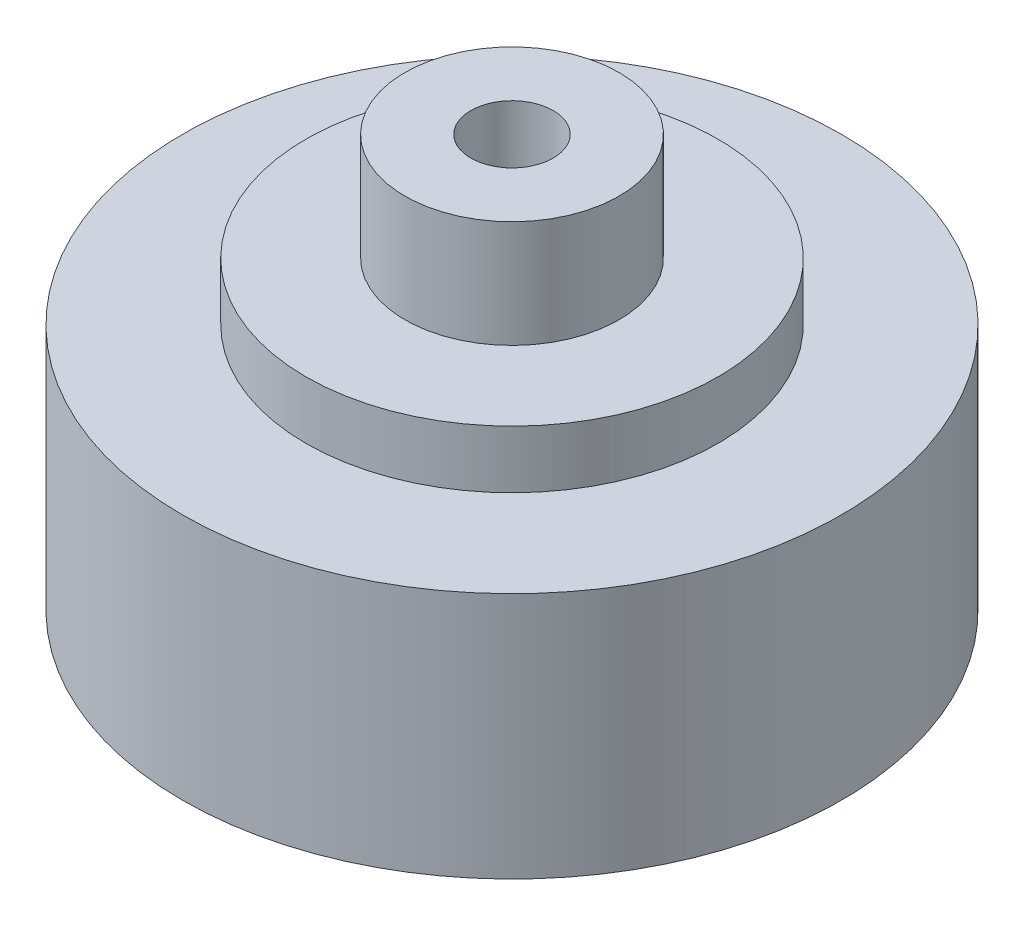
ISO-10303-21;
HEADER;
FILE_DESCRIPTION(('STEP AP214'),'2;1');
FILE_NAME('part.step','',(''),(''),'','','');
FILE_SCHEMA(('AUTOMOTIVE_DESIGN { 1 0 10303 214 1 1 1 1 }'));
ENDSEC;
DATA;
#1=APPLICATION_CONTEXT('core data for automotive mechanical design processes');
#2=APPLICATION_PROTOCOL_DEFINITION('international standard','automotive_design',2000,#1);
#3=PRODUCT_CONTEXT('',#1,'mechanical');
#4=PRODUCT('Part','Part','',(#3));
#5=PRODUCT_RELATED_PRODUCT_CATEGORY('part','',(#4));
#6=PRODUCT_DEFINITION_FORMATION('','',#4);
#7=PRODUCT_DEFINITION_CONTEXT('part definition',#1,'design');
#8=PRODUCT_DEFINITION('design','',#6,#7);
#9=PRODUCT_DEFINITION_SHAPE('','',#8);
#10=(LENGTH_UNIT() NAMED_UNIT(*) SI_UNIT(.MILLI.,.METRE.));
#11=(NAMED_UNIT(*) PLANE_ANGLE_UNIT() SI_UNIT($,.RADIAN.));
#12=(NAMED_UNIT(*) SI_UNIT($,.STERADIAN.) SOLID_ANGLE_UNIT());
#13=UNCERTAINTY_MEASURE_WITH_UNIT(LENGTH_MEASURE(1.E-05),#10,'distance_accuracy_value','');
#14=(GEOMETRIC_REPRESENTATION_CONTEXT(3) GLOBAL_UNCERTAINTY_ASSIGNED_CONTEXT((#13)) GLOBAL_UNIT_ASSIGNED_CONTEXT((#10,
#11,#12)) REPRESENTATION_CONTEXT('',''));
#15=CARTESIAN_POINT('',(0.,0.,0.));
#16=DIRECTION('',(0.,0.,1.));
#17=DIRECTION('',(1.,0.,0.));
#18=AXIS2_PLACEMENT_3D('',#15,#16,#17);
#19=CARTESIAN_POINT('',(0.,37.,0.));
#20=DIRECTION('',(0.,-1.,0.));
#21=DIRECTION('',(0.,0.,-1.));
#22=AXIS2_PLACEMENT_3D('',#19,#20,#21);
#23=CYLINDRICAL_SURFACE('',#22,25.);
#24=CARTESIAN_POINT('',(0.,37.,0.));
#25=DIRECTION('',(0.,1.,0.));
#26=DIRECTION('',(0.,0.,1.));
#27=AXIS2_PLACEMENT_3D('',#24,#25,#26);
#28=CIRCLE('',#27,25.);
#29=CARTESIAN_POINT('',(0.,37.,25.));
#30=VERTEX_POINT('',#29);
#31=EDGE_CURVE('E54',#30,#30,#28,.T.);
#32=ORIENTED_EDGE('',*,*,#31,.F.);
#33=EDGE_LOOP('',(#32));
#34=FACE_BOUND('',#33,.T.);
#35=CARTESIAN_POINT('',(0.,30.,0.));
#36=DIRECTION('',(0.,1.,0.));
#37=DIRECTION('',(0.,0.,1.));
#38=AXIS2_PLACEMENT_3D('',#35,#36,#37);
#39=CIRCLE('',#38,25.);
#40=CARTESIAN_POINT('',(0.,30.,25.));
#41=VERTEX_POINT('',#40);
#42=EDGE_CURVE('E50',#41,#41,#39,.T.);
#43=ORIENTED_EDGE('',*,*,#42,.T.);
#44=EDGE_LOOP('',(#43));
#45=FACE_BOUND('',#44,.T.);
#46=ADVANCED_FACE('F47',(#34,#45),#23,.T.);
#47=CARTESIAN_POINT('',(0.,37.,0.));
#48=DIRECTION('',(0.,1.,0.));
#49=DIRECTION('',(0.,0.,1.));
#50=AXIS2_PLACEMENT_3D('',#47,#48,#49);
#51=PLANE('',#50);
#52=CARTESIAN_POINT('',(0.,37.,0.));
#53=DIRECTION('',(0.,1.,0.));
#54=DIRECTION('',(0.,0.,1.));
#55=AXIS2_PLACEMENT_3D('',#52,#53,#54);
#56=CIRCLE('',#55,13.);
#57=CARTESIAN_POINT('',(0.,37.,-13.));
#58=VERTEX_POINT('',#57);
#59=EDGE_CURVE('E11',#58,#58,#56,.T.);
#60=ORIENTED_EDGE('',*,*,#59,.F.);
#61=EDGE_LOOP('',(#60));
#62=FACE_BOUND('',#61,.T.);
#63=ORIENTED_EDGE('',*,*,#31,.T.);
#64=EDGE_LOOP('',(#63));
#65=FACE_BOUND('',#64,.T.);
#66=ADVANCED_FACE('F83',(#62,#65),#51,.T.);
#67=CARTESIAN_POINT('',(0.,30.,0.));
#68=DIRECTION('',(0.,1.,0.));
#69=DIRECTION('',(0.,0.,1.));
#70=AXIS2_PLACEMENT_3D('',#67,#68,#69);
#71=PLANE('',#70);
#72=CARTESIAN_POINT('',(0.,30.,0.));
#73=DIRECTION('',(0.,1.,0.));
#74=DIRECTION('',(0.,0.,1.));
#75=AXIS2_PLACEMENT_3D('',#72,#73,#74);
#76=CIRCLE('',#75,5.);
#77=CARTESIAN_POINT('',(0.,30.,5.));
#78=VERTEX_POINT('',#77);
#79=EDGE_CURVE('E63',#78,#78,#76,.T.);
#80=ORIENTED_EDGE('',*,*,#79,.T.);
#81=EDGE_LOOP('',(#80));
#82=FACE_BOUND('',#81,.T.);
#83=ORIENTED_EDGE('',*,*,#42,.F.);
#84=EDGE_LOOP('',(#83));
#85=FACE_BOUND('',#84,.T.);
#86=ADVANCED_FACE('F79',(#82,#85),#71,.F.);
#87=CARTESIAN_POINT('',(0.,50.,0.));
#88=DIRECTION('',(0.,-1.,0.));
#89=DIRECTION('',(0.,0.,-1.));
#90=AXIS2_PLACEMENT_3D('',#87,#88,#89);
#91=CYLINDRICAL_SURFACE('',#90,13.);
#92=CARTESIAN_POINT('',(0.,50.,0.));
#93=DIRECTION('',(0.,1.,0.));
#94=DIRECTION('',(0.,0.,1.));
#95=AXIS2_PLACEMENT_3D('',#92,#93,#94);
#96=CIRCLE('',#95,13.);
#97=CARTESIAN_POINT('',(0.,50.,-13.));
#98=VERTEX_POINT('',#97);
#99=EDGE_CURVE('E60',#98,#98,#96,.T.);
#100=CARTESIAN_POINT('',(0.,50.,-13.));
#101=CARTESIAN_POINT('',(0.,49.8645833333333,-13.));
#102=CARTESIAN_POINT('',(0.,49.7291666666667,-13.));
#103=CARTESIAN_POINT('',(0.,49.4583333333333,-13.));
#104=CARTESIAN_POINT('',(0.,49.3229166666667,-13.));
#105=CARTESIAN_POINT('',(0.,49.0520833333333,-13.));
#106=CARTESIAN_POINT('',(0.,48.9166666666667,-13.));
#107=CARTESIAN_POINT('',(0.,48.6458333333333,-13.));
#108=CARTESIAN_POINT('',(0.,48.5104166666667,-13.));
#109=CARTESIAN_POINT('',(0.,48.2395833333333,-13.));
#110=CARTESIAN_POINT('',(0.,48.1041666666667,-13.));
#111=CARTESIAN_POINT('',(0.,47.8333333333333,-13.));
#112=CARTESIAN_POINT('',(0.,47.6979166666667,-13.));
#113=CARTESIAN_POINT('',(0.,47.4270833333333,-13.));
#114=CARTESIAN_POINT('',(0.,47.2916666666667,-13.));
#115=CARTESIAN_POINT('',(0.,47.0208333333333,-13.));
#116=CARTESIAN_POINT('',(0.,46.8854166666667,-13.));
#117=CARTESIAN_POINT('',(0.,46.6145833333333,-13.));
#118=CARTESIAN_POINT('',(0.,46.4791666666667,-13.));
#119=CARTESIAN_POINT('',(0.,46.2083333333333,-13.));
#120=CARTESIAN_POINT('',(0.,46.0729166666667,-13.));
#121=CARTESIAN_POINT('',(0.,45.8020833333333,-13.));
#122=CARTESIAN_POINT('',(0.,45.6666666666667,-13.));
#123=CARTESIAN_POINT('',(0.,45.3958333333333,-13.));
#124=CARTESIAN_POINT('',(0.,45.2604166666667,-13.));
#125=CARTESIAN_POINT('',(0.,44.9895833333333,-13.));
#126=CARTESIAN_POINT('',(0.,44.8541666666667,-13.));
#127=CARTESIAN_POINT('',(0.,44.5833333333333,-13.));
#128=CARTESIAN_POINT('',(0.,44.4479166666667,-13.));
#129=CARTESIAN_POINT('',(0.,44.1770833333333,-13.));
#130=CARTESIAN_POINT('',(0.,44.0416666666667,-13.));
#131=CARTESIAN_POINT('',(0.,43.7708333333333,-13.));
#132=CARTESIAN_POINT('',(0.,43.6354166666667,-13.));
#133=CARTESIAN_POINT('',(0.,43.3645833333333,-13.));
#134=CARTESIAN_POINT('',(0.,43.2291666666667,-13.));
#135=CARTESIAN_POINT('',(0.,42.9583333333333,-13.));
#136=CARTESIAN_POINT('',(0.,42.8229166666667,-13.));
#137=CARTESIAN_POINT('',(0.,42.5520833333333,-13.));
#138=CARTESIAN_POINT('',(0.,42.4166666666667,-13.));
#139=CARTESIAN_POINT('',(0.,42.1458333333333,-13.));
#140=CARTESIAN_POINT('',(0.,42.0104166666667,-13.));
#141=CARTESIAN_POINT('',(0.,41.7395833333333,-13.));
#142=CARTESIAN_POINT('',(0.,41.6041666666667,-13.));
#143=CARTESIAN_POINT('',(0.,41.3333333333333,-13.));
#144=CARTESIAN_POINT('',(0.,41.1979166666667,-13.));
#145=CARTESIAN_POINT('',(0.,40.9270833333333,-13.));
#146=CARTESIAN_POINT('',(0.,40.7916666666667,-13.));
#147=CARTESIAN_POINT('',(0.,40.5208333333333,-13.));
#148=CARTESIAN_POINT('',(0.,40.3854166666667,-13.));
#149=CARTESIAN_POINT('',(0.,40.1145833333333,-13.));
#150=CARTESIAN_POINT('',(0.,39.9791666666667,-13.));
#151=CARTESIAN_POINT('',(0.,39.7083333333333,-13.));
#152=CARTESIAN_POINT('',(0.,39.5729166666667,-13.));
#153=CARTESIAN_POINT('',(0.,39.3020833333333,-13.));
#154=CARTESIAN_POINT('',(0.,39.1666666666667,-13.));
#155=CARTESIAN_POINT('',(0.,38.8958333333333,-13.));
#156=CARTESIAN_POINT('',(0.,38.7604166666667,-13.));
#157=CARTESIAN_POINT('',(0.,38.4895833333333,-13.));
#158=CARTESIAN_POINT('',(0.,38.3541666666667,-13.));
#159=CARTESIAN_POINT('',(0.,38.0833333333333,-13.));
#160=CARTESIAN_POINT('',(0.,37.9479166666667,-13.));
#161=CARTESIAN_POINT('',(0.,37.6770833333333,-13.));
#162=CARTESIAN_POINT('',(0.,37.5416666666667,-13.));
#163=CARTESIAN_POINT('',(0.,37.2708333333333,-13.));
#164=CARTESIAN_POINT('',(0.,37.1354166666667,-13.));
#165=CARTESIAN_POINT('',(0.,37.,-13.));
#166=B_SPLINE_CURVE_WITH_KNOTS('',3,(#100,#101,#102,#103,#104,#105,#106,#107,#108,#109,#110,
#111,#112,#113,#114,#115,#116,#117,#118,#119,#120,#121,#122,#123,#124,#125,#126,#127,#128,#129,
#130,#131,#132,#133,#134,#135,#136,#137,#138,#139,#140,#141,#142,#143,#144,#145,#146,#147,#148,
#149,#150,#151,#152,#153,#154,#155,#156,#157,#158,#159,#160,#161,#162,#163,#164,#165),
.UNSPECIFIED.,.F.,.F.,(4,2,2,2,2,2,2,2,2,2,2,2,2,2,2,2,2,2,2,2,2,2,2,2,2,2,2,2,2,2,2,2,4),(0.,
0.406249999999997,0.812499999999994,1.21875,1.62499999999999,2.03125,2.4375,2.84374999999999,
3.25,3.65624999999999,4.0625,4.46874999999999,4.875,5.28124999999999,5.6875,6.09374999999999,
6.49999999999999,6.90625,7.31249999999999,7.71875,8.12499999999999,8.53124999999999,
8.93749999999999,9.34374999999999,9.74999999999999,10.15625,10.5625,10.96875,11.375,11.78125,
12.1875,12.59375,13.),.UNSPECIFIED.);
#167=EDGE_CURVE('BSEAM82',#98,#58,#166,.T.);
#168=ORIENTED_EDGE('',*,*,#99,.F.);
#169=ORIENTED_EDGE('',*,*,#59,.T.);
#170=ORIENTED_EDGE('',*,*,#167,.T.);
#171=ORIENTED_EDGE('',*,*,#167,.F.);
#172=EDGE_LOOP('',(#168,#170,#169,#171));
#173=FACE_BOUND('',#172,.T.);
#174=ADVANCED_FACE('F82',(#173),#91,.T.);
#175=CARTESIAN_POINT('',(0.,50.,0.));
#176=DIRECTION('',(0.,1.,0.));
#177=DIRECTION('',(0.,0.,1.));
#178=AXIS2_PLACEMENT_3D('',#175,#176,#177);
#179=PLANE('',#178);
#180=CARTESIAN_POINT('',(0.,50.,0.));
#181=DIRECTION('',(0.,-1.,0.));
#182=DIRECTION('',(0.,0.,-1.));
#183=AXIS2_PLACEMENT_3D('',#180,#181,#182);
#184=CIRCLE('',#183,5.);
#185=CARTESIAN_POINT('',(0.,50.,-5.));
#186=VERTEX_POINT('',#185);
#187=EDGE_CURVE('E66',#186,#186,#184,.T.);
#188=ORIENTED_EDGE('',*,*,#187,.T.);
#189=EDGE_LOOP('',(#188));
#190=FACE_BOUND('',#189,.T.);
#191=ORIENTED_EDGE('',*,*,#99,.T.);
#192=EDGE_LOOP('',(#191));
#193=FACE_BOUND('',#192,.T.);
#194=ADVANCED_FACE('F70',(#190,#193),#179,.T.);
#195=CARTESIAN_POINT('',(0.,50.,0.));
#196=DIRECTION('',(0.,-1.,0.));
#197=DIRECTION('',(0.,0.,-1.));
#198=AXIS2_PLACEMENT_3D('',#195,#196,#197);
#199=CYLINDRICAL_SURFACE('',#198,5.);
#200=ORIENTED_EDGE('',*,*,#187,.F.);
#201=EDGE_LOOP('',(#200));
#202=FACE_BOUND('',#201,.T.);
#203=ORIENTED_EDGE('',*,*,#79,.F.);
#204=EDGE_LOOP('',(#203));
#205=FACE_BOUND('',#204,.T.);
#206=ADVANCED_FACE('F73',(#202,#205),#199,.F.);
#207=CLOSED_SHELL('',(#46,#66,#86,#174,#194,#206));
#208=MANIFOLD_SOLID_BREP('B2',#207);
#209=CARTESIAN_POINT('',(0.,30.,0.));
#210=DIRECTION('',(0.,-1.,0.));
#211=DIRECTION('',(0.,0.,-1.));
#212=AXIS2_PLACEMENT_3D('',#209,#210,#211);
#213=CYLINDRICAL_SURFACE('',#212,40.);
#214=CARTESIAN_POINT('',(0.,30.,0.));
#215=DIRECTION('',(0.,1.,0.));
#216=DIRECTION('',(0.,0.,1.));
#217=AXIS2_PLACEMENT_3D('',#214,#215,#216);
#218=CIRCLE('',#217,40.);
#219=CARTESIAN_POINT('',(0.,30.,40.));
#220=VERTEX_POINT('',#219);
#221=EDGE_CURVE('E46',#220,#220,#218,.T.);
#222=ORIENTED_EDGE('',*,*,#221,.F.);
#223=EDGE_LOOP('',(#222));
#224=FACE_BOUND('',#223,.T.);
#225=CARTESIAN_POINT('',(0.,0.,0.));
#226=DIRECTION('',(0.,1.,0.));
#227=DIRECTION('',(0.,0.,1.));
#228=AXIS2_PLACEMENT_3D('',#225,#226,#227);
#229=CIRCLE('',#228,40.);
#230=CARTESIAN_POINT('',(0.,0.,40.));
#231=VERTEX_POINT('',#230);
#232=EDGE_CURVE('E142',#231,#231,#229,.T.);
#233=ORIENTED_EDGE('',*,*,#232,.T.);
#234=EDGE_LOOP('',(#233));
#235=FACE_BOUND('',#234,.T.);
#236=ADVANCED_FACE('F139',(#224,#235),#213,.T.);
#237=CARTESIAN_POINT('',(0.,30.,0.));
#238=DIRECTION('',(0.,1.,0.));
#239=DIRECTION('',(0.,0.,1.));
#240=AXIS2_PLACEMENT_3D('',#237,#238,#239);
#241=PLANE('',#240);
#242=CARTESIAN_POINT('',(0.,30.,0.));
#243=DIRECTION('',(0.,1.,0.));
#244=DIRECTION('',(0.,0.,1.));
#245=AXIS2_PLACEMENT_3D('',#242,#243,#244);
#246=CIRCLE('',#245,5.);
#247=CARTESIAN_POINT('',(0.,30.,5.));
#248=VERTEX_POINT('',#247);
#249=EDGE_CURVE('E149',#248,#248,#246,.T.);
#250=ORIENTED_EDGE('',*,*,#249,.F.);
#251=EDGE_LOOP('',(#250));
#252=FACE_BOUND('',#251,.T.);
#253=ORIENTED_EDGE('',*,*,#221,.T.);
#254=EDGE_LOOP('',(#253));
#255=FACE_BOUND('',#254,.T.);
#256=ADVANCED_FACE('F162',(#252,#255),#241,.T.);
#257=CARTESIAN_POINT('',(0.,0.,0.));
#258=DIRECTION('',(0.,1.,0.));
#259=DIRECTION('',(0.,0.,1.));
#260=AXIS2_PLACEMENT_3D('',#257,#258,#259);
#261=PLANE('',#260);
#262=CARTESIAN_POINT('',(0.,0.,0.));
#263=DIRECTION('',(0.,-1.,0.));
#264=DIRECTION('',(0.,0.,-1.));
#265=AXIS2_PLACEMENT_3D('',#262,#263,#264);
#266=CIRCLE('',#265,5.);
#267=CARTESIAN_POINT('',(0.,0.,-5.));
#268=VERTEX_POINT('',#267);
#269=EDGE_CURVE('E153',#268,#268,#266,.T.);
#270=ORIENTED_EDGE('',*,*,#269,.F.);
#271=EDGE_LOOP('',(#270));
#272=FACE_BOUND('',#271,.T.);
#273=ORIENTED_EDGE('',*,*,#232,.F.);
#274=EDGE_LOOP('',(#273));
#275=FACE_BOUND('',#274,.T.);
#276=ADVANCED_FACE('F159',(#272,#275),#261,.F.);
#277=CARTESIAN_POINT('',(0.,50.,0.));
#278=DIRECTION('',(0.,-1.,0.));
#279=DIRECTION('',(0.,0.,-1.));
#280=AXIS2_PLACEMENT_3D('',#277,#278,#279);
#281=CYLINDRICAL_SURFACE('',#280,5.);
#282=ORIENTED_EDGE('',*,*,#249,.T.);
#283=EDGE_LOOP('',(#282));
#284=FACE_BOUND('',#283,.T.);
#285=ORIENTED_EDGE('',*,*,#269,.T.);
#286=EDGE_LOOP('',(#285));
#287=FACE_BOUND('',#286,.T.);
#288=ADVANCED_FACE('F157',(#284,#287),#281,.F.);
#289=CLOSED_SHELL('',(#236,#256,#276,#288));
#290=MANIFOLD_SOLID_BREP('B6',#289);
#291=ADVANCED_BREP_SHAPE_REPRESENTATION('',(#18,#208,#290),#14);
#292=SHAPE_DEFINITION_REPRESENTATION(#9,#291);
ENDSEC;
END-ISO-10303-21;
